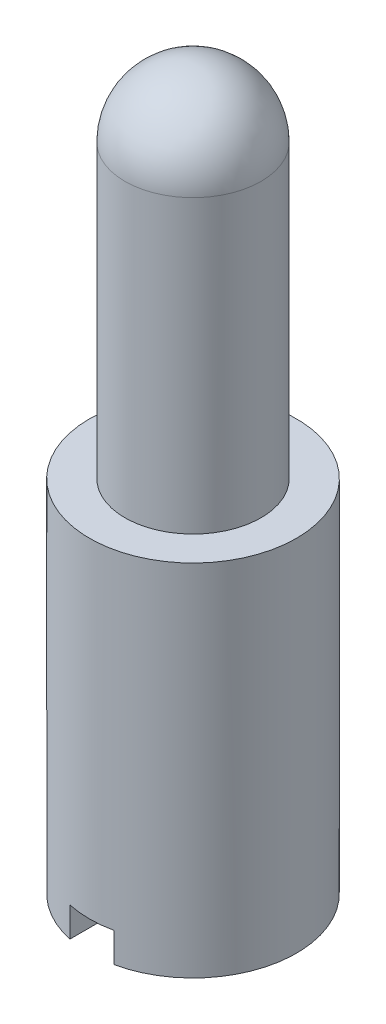
ISO-10303-21;
HEADER;
FILE_DESCRIPTION(('STEP AP214'),'2;1');
FILE_NAME('part.step','',(''),(''),'','','');
FILE_SCHEMA(('AUTOMOTIVE_DESIGN { 1 0 10303 214 1 1 1 1 }'));
ENDSEC;
DATA;
#1=APPLICATION_CONTEXT('core data for automotive mechanical design processes');
#2=APPLICATION_PROTOCOL_DEFINITION('international standard','automotive_design',2000,#1);
#3=PRODUCT_CONTEXT('',#1,'mechanical');
#4=PRODUCT('Part','Part','',(#3));
#5=PRODUCT_RELATED_PRODUCT_CATEGORY('part','',(#4));
#6=PRODUCT_DEFINITION_FORMATION('','',#4);
#7=PRODUCT_DEFINITION_CONTEXT('part definition',#1,'design');
#8=PRODUCT_DEFINITION('design','',#6,#7);
#9=PRODUCT_DEFINITION_SHAPE('','',#8);
#10=(LENGTH_UNIT() NAMED_UNIT(*) SI_UNIT(.MILLI.,.METRE.));
#11=(NAMED_UNIT(*) PLANE_ANGLE_UNIT() SI_UNIT($,.RADIAN.));
#12=(NAMED_UNIT(*) SI_UNIT($,.STERADIAN.) SOLID_ANGLE_UNIT());
#13=UNCERTAINTY_MEASURE_WITH_UNIT(LENGTH_MEASURE(1.E-05),#10,'distance_accuracy_value','');
#14=(GEOMETRIC_REPRESENTATION_CONTEXT(3) GLOBAL_UNCERTAINTY_ASSIGNED_CONTEXT((#13)) GLOBAL_UNIT_ASSIGNED_CONTEXT((#10,
#11,#12)) REPRESENTATION_CONTEXT('',''));
#15=CARTESIAN_POINT('',(0.,0.,0.));
#16=DIRECTION('',(0.,0.,1.));
#17=DIRECTION('',(1.,0.,0.));
#18=AXIS2_PLACEMENT_3D('',#15,#16,#17);
#19=CARTESIAN_POINT('',(0.,0.,0.));
#20=DIRECTION('',(0.,1.,0.));
#21=DIRECTION('',(-1.,0.,0.));
#22=AXIS2_PLACEMENT_3D('',#19,#20,#21);
#23=PLANE('',#22);
#24=CARTESIAN_POINT('',(0.,0.,0.));
#25=DIRECTION('',(0.,1.,0.));
#26=DIRECTION('',(-1.,0.,0.));
#27=AXIS2_PLACEMENT_3D('',#24,#25,#26);
#28=CIRCLE('',#27,2.7432);
#29=CARTESIAN_POINT('',(0.5842,0.,2.68027173995474));
#30=VERTEX_POINT('',#29);
#31=CARTESIAN_POINT('',(0.5842,0.,-2.68027173995474));
#32=VERTEX_POINT('',#31);
#33=EDGE_CURVE('E95',#30,#32,#28,.T.);
#34=ORIENTED_EDGE('',*,*,#33,.F.);
#35=DIRECTION('',(0.,0.,1.));
#36=VECTOR('',#35,1.);
#37=CARTESIAN_POINT('',(0.5842,0.,-3.08264733135388));
#38=LINE('',#37,#36);
#39=EDGE_CURVE('E85',#32,#30,#38,.T.);
#40=ORIENTED_EDGE('',*,*,#39,.F.);
#41=EDGE_LOOP('',(#34,#40));
#42=FACE_BOUND('',#41,.T.);
#43=ADVANCED_FACE('F41',(#42),#23,.F.);
#44=CARTESIAN_POINT('',(0.,17.2466,0.));
#45=DIRECTION('',(0.,1.,0.));
#46=DIRECTION('',(1.,0.,0.));
#47=AXIS2_PLACEMENT_3D('',#44,#45,#46);
#48=SPHERICAL_SURFACE('',#47,1.8034);
#49=CARTESIAN_POINT('',(0.,17.2466,0.));
#50=DIRECTION('',(0.,1.,0.));
#51=DIRECTION('',(-1.,0.,0.));
#52=AXIS2_PLACEMENT_3D('',#49,#50,#51);
#53=CIRCLE('',#52,1.8034);
#54=CARTESIAN_POINT('',(-1.8034,17.2466,0.));
#55=VERTEX_POINT('',#54);
#56=EDGE_CURVE('E130',#55,#55,#53,.T.);
#57=ORIENTED_EDGE('',*,*,#56,.T.);
#58=EDGE_LOOP('',(#57));
#59=FACE_BOUND('',#58,.T.);
#60=ADVANCED_FACE('F43',(#59),#48,.T.);
#61=CARTESIAN_POINT('',(-0.5842,0.,-2.68027173995474));
#62=VERTEX_POINT('',#61);
#63=CARTESIAN_POINT('',(-0.5842,0.,2.68027173995474));
#64=VERTEX_POINT('',#63);
#65=EDGE_CURVE('E103',#62,#64,#28,.T.);
#66=ORIENTED_EDGE('',*,*,#65,.F.);
#67=DIRECTION('',(0.,0.,-1.));
#68=VECTOR('',#67,1.);
#69=CARTESIAN_POINT('',(-0.5842,0.,-3.08264733135388));
#70=LINE('',#69,#68);
#71=EDGE_CURVE('E97',#64,#62,#70,.T.);
#72=ORIENTED_EDGE('',*,*,#71,.F.);
#73=EDGE_LOOP('',(#66,#72));
#74=FACE_BOUND('',#73,.T.);
#75=ADVANCED_FACE('F123',(#74),#23,.F.);
#76=CARTESIAN_POINT('',(0.,19.05,0.));
#77=DIRECTION('',(0.,1.,0.));
#78=DIRECTION('',(-1.,0.,0.));
#79=AXIS2_PLACEMENT_3D('',#76,#77,#78);
#80=CYLINDRICAL_SURFACE('',#79,2.7432);
#81=CARTESIAN_POINT('',(0.,0.787400000000001,0.));
#82=DIRECTION('',(0.,1.,0.));
#83=DIRECTION('',(-1.,0.,0.));
#84=AXIS2_PLACEMENT_3D('',#81,#82,#83);
#85=CIRCLE('',#84,2.7432);
#86=CARTESIAN_POINT('',(-0.5842,0.787400000000001,2.68027173995474));
#87=VERTEX_POINT('',#86);
#88=CARTESIAN_POINT('',(0.5842,0.787400000000001,2.68027173995474));
#89=VERTEX_POINT('',#88);
#90=EDGE_CURVE('E62',#87,#89,#85,.T.);
#91=ORIENTED_EDGE('',*,*,#90,.T.);
#92=DIRECTION('',(0.,1.,0.));
#93=VECTOR('',#92,1.);
#94=CARTESIAN_POINT('',(0.5842,19.05,2.68027173995474));
#95=LINE('',#94,#93);
#96=EDGE_CURVE('E11',#89,#30,#95,.F.);
#97=ORIENTED_EDGE('',*,*,#96,.T.);
#98=ORIENTED_EDGE('',*,*,#33,.T.);
#99=DIRECTION('',(0.,1.,0.));
#100=VECTOR('',#99,1.);
#101=CARTESIAN_POINT('',(0.5842,19.05,-2.68027173995474));
#102=LINE('',#101,#100);
#103=CARTESIAN_POINT('',(0.5842,0.787400000000001,-2.68027173995474));
#104=VERTEX_POINT('',#103);
#105=EDGE_CURVE('E82',#32,#104,#102,.T.);
#106=ORIENTED_EDGE('',*,*,#105,.T.);
#107=CARTESIAN_POINT('',(-0.5842,0.787400000000001,-2.68027173995474));
#108=VERTEX_POINT('',#107);
#109=EDGE_CURVE('E102',#104,#108,#85,.T.);
#110=ORIENTED_EDGE('',*,*,#109,.T.);
#111=DIRECTION('',(0.,1.,0.));
#112=VECTOR('',#111,1.);
#113=CARTESIAN_POINT('',(-0.5842,19.05,-2.68027173995474));
#114=LINE('',#113,#112);
#115=EDGE_CURVE('E91',#108,#62,#114,.F.);
#116=ORIENTED_EDGE('',*,*,#115,.T.);
#117=ORIENTED_EDGE('',*,*,#65,.T.);
#118=DIRECTION('',(0.,1.,0.));
#119=VECTOR('',#118,1.);
#120=CARTESIAN_POINT('',(-0.5842,19.05,2.68027173995474));
#121=LINE('',#120,#119);
#122=EDGE_CURVE('E50',#64,#87,#121,.T.);
#123=ORIENTED_EDGE('',*,*,#122,.T.);
#124=EDGE_LOOP('',(#91,#97,#98,#106,#110,#116,#117,#123));
#125=FACE_BOUND('',#124,.T.);
#126=CARTESIAN_POINT('',(0.,9.525,0.));
#127=DIRECTION('',(0.,1.,0.));
#128=DIRECTION('',(-1.,0.,0.));
#129=AXIS2_PLACEMENT_3D('',#126,#127,#128);
#130=CIRCLE('',#129,2.7432);
#131=CARTESIAN_POINT('',(-2.7432,9.525,0.));
#132=VERTEX_POINT('',#131);
#133=EDGE_CURVE('E109',#132,#132,#130,.T.);
#134=ORIENTED_EDGE('',*,*,#133,.F.);
#135=EDGE_LOOP('',(#134));
#136=FACE_BOUND('',#135,.T.);
#137=ADVANCED_FACE('F99',(#125,#136),#80,.T.);
#138=CARTESIAN_POINT('',(2.7432,9.525,0.));
#139=DIRECTION('',(0.,-1.,0.));
#140=DIRECTION('',(1.,0.,0.));
#141=AXIS2_PLACEMENT_3D('',#138,#139,#140);
#142=PLANE('',#141);
#143=CARTESIAN_POINT('',(0.,9.525,0.));
#144=DIRECTION('',(0.,1.,0.));
#145=DIRECTION('',(-1.,0.,0.));
#146=AXIS2_PLACEMENT_3D('',#143,#144,#145);
#147=CIRCLE('',#146,1.8034);
#148=CARTESIAN_POINT('',(-1.8034,9.525,0.));
#149=VERTEX_POINT('',#148);
#150=EDGE_CURVE('E133',#149,#149,#147,.T.);
#151=ORIENTED_EDGE('',*,*,#150,.F.);
#152=EDGE_LOOP('',(#151));
#153=FACE_BOUND('',#152,.T.);
#154=ORIENTED_EDGE('',*,*,#133,.T.);
#155=EDGE_LOOP('',(#154));
#156=FACE_BOUND('',#155,.T.);
#157=ADVANCED_FACE('F142',(#153,#156),#142,.F.);
#158=CARTESIAN_POINT('',(0.,19.05,0.));
#159=DIRECTION('',(0.,1.,0.));
#160=DIRECTION('',(-1.,0.,0.));
#161=AXIS2_PLACEMENT_3D('',#158,#159,#160);
#162=CYLINDRICAL_SURFACE('',#161,1.8034);
#163=ORIENTED_EDGE('',*,*,#56,.F.);
#164=EDGE_LOOP('',(#163));
#165=FACE_BOUND('',#164,.T.);
#166=ORIENTED_EDGE('',*,*,#150,.T.);
#167=EDGE_LOOP('',(#166));
#168=FACE_BOUND('',#167,.T.);
#169=ADVANCED_FACE('F149',(#165,#168),#162,.T.);
#170=CARTESIAN_POINT('',(0.5842,0.7874,-3.08264733135388));
#171=DIRECTION('',(1.,0.,0.));
#172=DIRECTION('',(0.,1.,0.));
#173=AXIS2_PLACEMENT_3D('',#170,#171,#172);
#174=PLANE('',#173);
#175=ORIENTED_EDGE('',*,*,#39,.T.);
#176=ORIENTED_EDGE('',*,*,#96,.F.);
#177=DIRECTION('',(0.,0.,1.));
#178=VECTOR('',#177,1.);
#179=CARTESIAN_POINT('',(0.5842,0.7874,-3.08264733135388));
#180=LINE('',#179,#178);
#181=EDGE_CURVE('E86',#104,#89,#180,.T.);
#182=ORIENTED_EDGE('',*,*,#181,.F.);
#183=ORIENTED_EDGE('',*,*,#105,.F.);
#184=EDGE_LOOP('',(#175,#176,#182,#183));
#185=FACE_BOUND('',#184,.T.);
#186=ADVANCED_FACE('F84',(#185),#174,.F.);
#187=CARTESIAN_POINT('',(-0.5842,0.7874,-3.08264733135388));
#188=DIRECTION('',(-1.,0.,0.));
#189=DIRECTION('',(0.,-1.,0.));
#190=AXIS2_PLACEMENT_3D('',#187,#188,#189);
#191=PLANE('',#190);
#192=ORIENTED_EDGE('',*,*,#71,.T.);
#193=ORIENTED_EDGE('',*,*,#115,.F.);
#194=DIRECTION('',(0.,0.,-1.));
#195=VECTOR('',#194,1.);
#196=CARTESIAN_POINT('',(-0.5842,0.7874,-3.08264733135388));
#197=LINE('',#196,#195);
#198=EDGE_CURVE('E57',#87,#108,#197,.T.);
#199=ORIENTED_EDGE('',*,*,#198,.F.);
#200=ORIENTED_EDGE('',*,*,#122,.F.);
#201=EDGE_LOOP('',(#192,#193,#199,#200));
#202=FACE_BOUND('',#201,.T.);
#203=ADVANCED_FACE('F121',(#202),#191,.F.);
#204=CARTESIAN_POINT('',(0.,0.7874,0.));
#205=DIRECTION('',(0.,1.,0.));
#206=DIRECTION('',(-1.,0.,0.));
#207=AXIS2_PLACEMENT_3D('',#204,#205,#206);
#208=PLANE('',#207);
#209=ORIENTED_EDGE('',*,*,#198,.T.);
#210=ORIENTED_EDGE('',*,*,#109,.F.);
#211=ORIENTED_EDGE('',*,*,#181,.T.);
#212=ORIENTED_EDGE('',*,*,#90,.F.);
#213=EDGE_LOOP('',(#209,#210,#211,#212));
#214=FACE_BOUND('',#213,.T.);
#215=ADVANCED_FACE('F170',(#214),#208,.F.);
#216=CLOSED_SHELL('',(#43,#60,#75,#137,#157,#169,#186,#203,#215));
#217=MANIFOLD_SOLID_BREP('B2',#216);
#218=ADVANCED_BREP_SHAPE_REPRESENTATION('',(#18,#217),#14);
#219=SHAPE_DEFINITION_REPRESENTATION(#9,#218);
ENDSEC;
END-ISO-10303-21;
